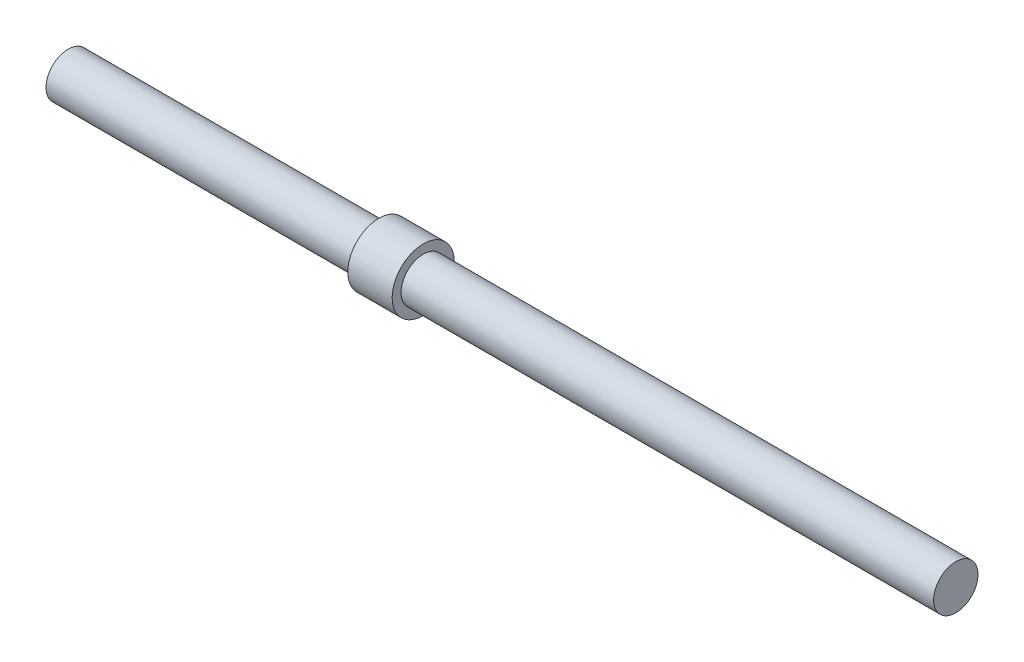
ISO-10303-21;
HEADER;
FILE_DESCRIPTION(('STEP AP214'),'2;1');
FILE_NAME('part.step','',(''),(''),'','','');
FILE_SCHEMA(('AUTOMOTIVE_DESIGN { 1 0 10303 214 1 1 1 1 }'));
ENDSEC;
DATA;
#1=APPLICATION_CONTEXT('core data for automotive mechanical design processes');
#2=APPLICATION_PROTOCOL_DEFINITION('international standard','automotive_design',2000,#1);
#3=PRODUCT_CONTEXT('',#1,'mechanical');
#4=PRODUCT('Part','Part','',(#3));
#5=PRODUCT_RELATED_PRODUCT_CATEGORY('part','',(#4));
#6=PRODUCT_DEFINITION_FORMATION('','',#4);
#7=PRODUCT_DEFINITION_CONTEXT('part definition',#1,'design');
#8=PRODUCT_DEFINITION('design','',#6,#7);
#9=PRODUCT_DEFINITION_SHAPE('','',#8);
#10=(LENGTH_UNIT() NAMED_UNIT(*) SI_UNIT(.MILLI.,.METRE.));
#11=(NAMED_UNIT(*) PLANE_ANGLE_UNIT() SI_UNIT($,.RADIAN.));
#12=(NAMED_UNIT(*) SI_UNIT($,.STERADIAN.) SOLID_ANGLE_UNIT());
#13=UNCERTAINTY_MEASURE_WITH_UNIT(LENGTH_MEASURE(1.E-05),#10,'distance_accuracy_value','');
#14=(GEOMETRIC_REPRESENTATION_CONTEXT(3) GLOBAL_UNCERTAINTY_ASSIGNED_CONTEXT((#13)) GLOBAL_UNIT_ASSIGNED_CONTEXT((#10,
#11,#12)) REPRESENTATION_CONTEXT('',''));
#15=CARTESIAN_POINT('',(0.,0.,0.));
#16=DIRECTION('',(0.,0.,1.));
#17=DIRECTION('',(1.,0.,0.));
#18=AXIS2_PLACEMENT_3D('',#15,#16,#17);
#19=CARTESIAN_POINT('',(100.,0.,0.));
#20=DIRECTION('',(-1.,0.,0.));
#21=DIRECTION('',(0.,0.,1.));
#22=AXIS2_PLACEMENT_3D('',#19,#20,#21);
#23=CYLINDRICAL_SURFACE('',#22,5.);
#24=CARTESIAN_POINT('',(100.,0.,0.));
#25=DIRECTION('',(1.,0.,0.));
#26=DIRECTION('',(0.,0.,-1.));
#27=AXIS2_PLACEMENT_3D('',#24,#25,#26);
#28=CIRCLE('',#27,5.);
#29=CARTESIAN_POINT('',(100.,0.,-5.));
#30=VERTEX_POINT('',#29);
#31=EDGE_CURVE('E44',#30,#30,#28,.T.);
#32=ORIENTED_EDGE('',*,*,#31,.F.);
#33=EDGE_LOOP('',(#32));
#34=FACE_BOUND('',#33,.T.);
#35=CARTESIAN_POINT('',(-20.,0.,0.));
#36=DIRECTION('',(-1.,0.,0.));
#37=DIRECTION('',(0.,0.,1.));
#38=AXIS2_PLACEMENT_3D('',#35,#36,#37);
#39=CIRCLE('',#38,5.);
#40=CARTESIAN_POINT('',(-20.,0.,5.));
#41=VERTEX_POINT('',#40);
#42=EDGE_CURVE('E10',#41,#41,#39,.T.);
#43=ORIENTED_EDGE('',*,*,#42,.F.);
#44=EDGE_LOOP('',(#43));
#45=FACE_BOUND('',#44,.T.);
#46=ADVANCED_FACE('F37',(#34,#45),#23,.T.);
#47=CARTESIAN_POINT('',(100.,0.,0.));
#48=DIRECTION('',(1.,0.,0.));
#49=DIRECTION('',(0.,0.,-1.));
#50=AXIS2_PLACEMENT_3D('',#47,#48,#49);
#51=PLANE('',#50);
#52=ORIENTED_EDGE('',*,*,#31,.T.);
#53=EDGE_LOOP('',(#52));
#54=FACE_BOUND('',#53,.T.);
#55=ADVANCED_FACE('F73',(#54),#51,.T.);
#56=CARTESIAN_POINT('',(-20.,0.,0.));
#57=DIRECTION('',(-1.,0.,0.));
#58=DIRECTION('',(0.,0.,1.));
#59=AXIS2_PLACEMENT_3D('',#56,#57,#58);
#60=CYLINDRICAL_SURFACE('',#59,7.);
#61=CARTESIAN_POINT('',(-20.,0.,0.));
#62=DIRECTION('',(-1.,0.,0.));
#63=DIRECTION('',(0.,0.,1.));
#64=AXIS2_PLACEMENT_3D('',#61,#62,#63);
#65=CIRCLE('',#64,7.);
#66=CARTESIAN_POINT('',(-20.,0.,7.));
#67=VERTEX_POINT('',#66);
#68=EDGE_CURVE('E59',#67,#67,#65,.T.);
#69=ORIENTED_EDGE('',*,*,#68,.T.);
#70=EDGE_LOOP('',(#69));
#71=FACE_BOUND('',#70,.T.);
#72=CARTESIAN_POINT('',(-30.,0.,0.));
#73=DIRECTION('',(-1.,0.,0.));
#74=DIRECTION('',(0.,0.,1.));
#75=AXIS2_PLACEMENT_3D('',#72,#73,#74);
#76=CIRCLE('',#75,7.);
#77=CARTESIAN_POINT('',(-30.,0.,7.));
#78=VERTEX_POINT('',#77);
#79=EDGE_CURVE('E56',#78,#78,#76,.T.);
#80=ORIENTED_EDGE('',*,*,#79,.F.);
#81=EDGE_LOOP('',(#80));
#82=FACE_BOUND('',#81,.T.);
#83=ADVANCED_FACE('F70',(#71,#82),#60,.T.);
#84=CARTESIAN_POINT('',(-20.,0.,0.));
#85=DIRECTION('',(-1.,0.,0.));
#86=DIRECTION('',(0.,0.,1.));
#87=AXIS2_PLACEMENT_3D('',#84,#85,#86);
#88=PLANE('',#87);
#89=ORIENTED_EDGE('',*,*,#42,.T.);
#90=EDGE_LOOP('',(#89));
#91=FACE_BOUND('',#90,.T.);
#92=ORIENTED_EDGE('',*,*,#68,.F.);
#93=EDGE_LOOP('',(#92));
#94=FACE_BOUND('',#93,.T.);
#95=ADVANCED_FACE('F72',(#91,#94),#88,.F.);
#96=CARTESIAN_POINT('',(-30.,0.,0.));
#97=DIRECTION('',(-1.,0.,0.));
#98=DIRECTION('',(0.,0.,1.));
#99=AXIS2_PLACEMENT_3D('',#96,#97,#98);
#100=PLANE('',#99);
#101=CARTESIAN_POINT('',(-30.,0.,0.));
#102=DIRECTION('',(-1.,0.,0.));
#103=DIRECTION('',(0.,0.,1.));
#104=AXIS2_PLACEMENT_3D('',#101,#102,#103);
#105=CIRCLE('',#104,5.);
#106=CARTESIAN_POINT('',(-30.,0.,5.));
#107=VERTEX_POINT('',#106);
#108=EDGE_CURVE('E53',#107,#107,#105,.T.);
#109=ORIENTED_EDGE('',*,*,#108,.F.);
#110=EDGE_LOOP('',(#109));
#111=FACE_BOUND('',#110,.T.);
#112=ORIENTED_EDGE('',*,*,#79,.T.);
#113=EDGE_LOOP('',(#112));
#114=FACE_BOUND('',#113,.T.);
#115=ADVANCED_FACE('F68',(#111,#114),#100,.T.);
#116=CARTESIAN_POINT('',(-100.,0.,0.));
#117=DIRECTION('',(1.,0.,0.));
#118=DIRECTION('',(0.,0.,-1.));
#119=AXIS2_PLACEMENT_3D('',#116,#117,#118);
#120=PLANE('',#119);
#121=CARTESIAN_POINT('',(-100.,0.,0.));
#122=DIRECTION('',(1.,0.,0.));
#123=DIRECTION('',(0.,0.,-1.));
#124=AXIS2_PLACEMENT_3D('',#121,#122,#123);
#125=CIRCLE('',#124,5.);
#126=CARTESIAN_POINT('',(-100.,0.,-5.));
#127=VERTEX_POINT('',#126);
#128=EDGE_CURVE('E48',#127,#127,#125,.T.);
#129=ORIENTED_EDGE('',*,*,#128,.F.);
#130=EDGE_LOOP('',(#129));
#131=FACE_BOUND('',#130,.T.);
#132=ADVANCED_FACE('F89',(#131),#120,.F.);
#133=ORIENTED_EDGE('',*,*,#108,.T.);
#134=EDGE_LOOP('',(#133));
#135=FACE_BOUND('',#134,.T.);
#136=ORIENTED_EDGE('',*,*,#128,.T.);
#137=EDGE_LOOP('',(#136));
#138=FACE_BOUND('',#137,.T.);
#139=ADVANCED_FACE('F39',(#135,#138),#23,.T.);
#140=CLOSED_SHELL('',(#46,#55,#83,#95,#115,#132,#139));
#141=MANIFOLD_SOLID_BREP('B2',#140);
#142=ADVANCED_BREP_SHAPE_REPRESENTATION('',(#18,#141),#14);
#143=SHAPE_DEFINITION_REPRESENTATION(#9,#142);
ENDSEC;
END-ISO-10303-21;
